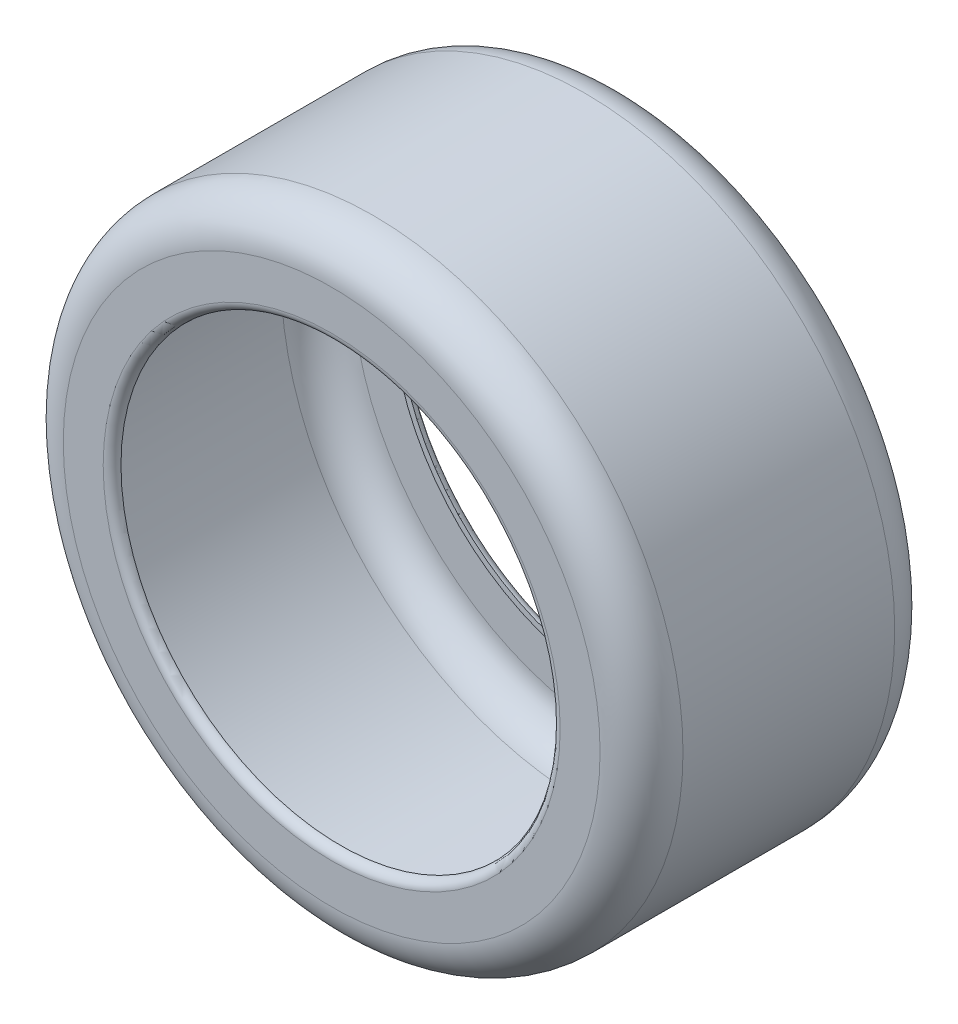
ISO-10303-21;
HEADER;
FILE_DESCRIPTION(('STEP AP214'),'2;1');
FILE_NAME('part.step','',(''),(''),'','','');
FILE_SCHEMA(('AUTOMOTIVE_DESIGN { 1 0 10303 214 1 1 1 1 }'));
ENDSEC;
DATA;
#1=APPLICATION_CONTEXT('core data for automotive mechanical design processes');
#2=APPLICATION_PROTOCOL_DEFINITION('international standard','automotive_design',2000,#1);
#3=PRODUCT_CONTEXT('',#1,'mechanical');
#4=PRODUCT('Part','Part','',(#3));
#5=PRODUCT_RELATED_PRODUCT_CATEGORY('part','',(#4));
#6=PRODUCT_DEFINITION_FORMATION('','',#4);
#7=PRODUCT_DEFINITION_CONTEXT('part definition',#1,'design');
#8=PRODUCT_DEFINITION('design','',#6,#7);
#9=PRODUCT_DEFINITION_SHAPE('','',#8);
#10=(LENGTH_UNIT() NAMED_UNIT(*) SI_UNIT(.MILLI.,.METRE.));
#11=(NAMED_UNIT(*) PLANE_ANGLE_UNIT() SI_UNIT($,.RADIAN.));
#12=(NAMED_UNIT(*) SI_UNIT($,.STERADIAN.) SOLID_ANGLE_UNIT());
#13=UNCERTAINTY_MEASURE_WITH_UNIT(LENGTH_MEASURE(1.E-05),#10,'distance_accuracy_value','');
#14=(GEOMETRIC_REPRESENTATION_CONTEXT(3) GLOBAL_UNCERTAINTY_ASSIGNED_CONTEXT((#13)) GLOBAL_UNIT_ASSIGNED_CONTEXT((#10,
#11,#12)) REPRESENTATION_CONTEXT('',''));
#15=CARTESIAN_POINT('',(0.,0.,0.));
#16=DIRECTION('',(0.,0.,1.));
#17=DIRECTION('',(1.,0.,0.));
#18=AXIS2_PLACEMENT_3D('',#15,#16,#17);
#19=CARTESIAN_POINT('',(0.,0.,124.38));
#20=DIRECTION('',(0.,0.,1.));
#21=DIRECTION('',(1.,0.,0.));
#22=AXIS2_PLACEMENT_3D('',#19,#20,#21);
#23=PLANE('',#22);
#24=CARTESIAN_POINT('',(0.,0.,124.38));
#25=DIRECTION('',(0.,0.,1.));
#26=DIRECTION('',(1.,0.,0.));
#27=AXIS2_PLACEMENT_3D('',#24,#25,#26);
#28=CIRCLE('',#27,192.92);
#29=CARTESIAN_POINT('',(192.92,0.,124.38));
#30=VERTEX_POINT('',#29);
#31=EDGE_CURVE('E11',#30,#30,#28,.F.);
#32=ORIENTED_EDGE('',*,*,#31,.T.);
#33=EDGE_LOOP('',(#32));
#34=FACE_BOUND('',#33,.T.);
#35=CARTESIAN_POINT('',(0.,0.,124.38));
#36=DIRECTION('',(0.,0.,1.));
#37=DIRECTION('',(1.,0.,0.));
#38=AXIS2_PLACEMENT_3D('',#35,#36,#37);
#39=CIRCLE('',#38,226.62);
#40=CARTESIAN_POINT('',(226.62,0.,124.38));
#41=VERTEX_POINT('',#40);
#42=EDGE_CURVE('E51',#41,#41,#39,.T.);
#43=ORIENTED_EDGE('',*,*,#42,.T.);
#44=EDGE_LOOP('',(#43));
#45=FACE_BOUND('',#44,.T.);
#46=ADVANCED_FACE('F40',(#34,#45),#23,.T.);
#47=CARTESIAN_POINT('',(0.,0.,-124.38));
#48=DIRECTION('',(0.,0.,1.));
#49=DIRECTION('',(1.,0.,0.));
#50=AXIS2_PLACEMENT_3D('',#47,#48,#49);
#51=PLANE('',#50);
#52=CARTESIAN_POINT('',(0.,0.,-124.38));
#53=DIRECTION('',(0.,0.,1.));
#54=DIRECTION('',(1.,0.,0.));
#55=AXIS2_PLACEMENT_3D('',#52,#53,#54);
#56=CIRCLE('',#55,192.92);
#57=CARTESIAN_POINT('',(192.92,0.,-124.38));
#58=VERTEX_POINT('',#57);
#59=EDGE_CURVE('E47',#58,#58,#56,.T.);
#60=ORIENTED_EDGE('',*,*,#59,.T.);
#61=EDGE_LOOP('',(#60));
#62=FACE_BOUND('',#61,.T.);
#63=CARTESIAN_POINT('',(0.,0.,-124.38));
#64=DIRECTION('',(0.,0.,1.));
#65=DIRECTION('',(1.,0.,0.));
#66=AXIS2_PLACEMENT_3D('',#63,#64,#65);
#67=CIRCLE('',#66,226.62);
#68=CARTESIAN_POINT('',(226.62,0.,-124.38));
#69=VERTEX_POINT('',#68);
#70=EDGE_CURVE('E55',#69,#69,#67,.F.);
#71=ORIENTED_EDGE('',*,*,#70,.T.);
#72=EDGE_LOOP('',(#71));
#73=FACE_BOUND('',#72,.T.);
#74=ADVANCED_FACE('F112',(#62,#73),#51,.F.);
#75=CARTESIAN_POINT('',(0.,0.,124.38));
#76=DIRECTION('',(0.,0.,-1.));
#77=DIRECTION('',(-1.,0.,0.));
#78=AXIS2_PLACEMENT_3D('',#75,#76,#77);
#79=CYLINDRICAL_SURFACE('',#78,261.62);
#80=CARTESIAN_POINT('',(0.,0.,-89.38));
#81=DIRECTION('',(0.,0.,1.));
#82=DIRECTION('',(1.,0.,0.));
#83=AXIS2_PLACEMENT_3D('',#80,#81,#82);
#84=CIRCLE('',#83,261.62);
#85=CARTESIAN_POINT('',(-261.62,0.,-89.3800000000001));
#86=VERTEX_POINT('',#85);
#87=EDGE_CURVE('E60',#86,#86,#84,.T.);
#88=CARTESIAN_POINT('',(0.,0.,89.38));
#89=DIRECTION('',(0.,0.,1.));
#90=DIRECTION('',(1.,0.,0.));
#91=AXIS2_PLACEMENT_3D('',#88,#89,#90);
#92=CIRCLE('',#91,261.62);
#93=CARTESIAN_POINT('',(-261.62,0.,89.38));
#94=VERTEX_POINT('',#93);
#95=EDGE_CURVE('E63',#94,#94,#92,.F.);
#96=CARTESIAN_POINT('',(-261.62,0.,-89.3800000000001));
#97=CARTESIAN_POINT('',(-261.62,0.,-87.5179166666667));
#98=CARTESIAN_POINT('',(-261.62,0.,-85.6558333333334));
#99=CARTESIAN_POINT('',(-261.62,0.,-81.9316666666667));
#100=CARTESIAN_POINT('',(-261.62,0.,-80.0695833333334));
#101=CARTESIAN_POINT('',(-261.62,0.,-76.3454166666667));
#102=CARTESIAN_POINT('',(-261.62,0.,-74.4833333333334));
#103=CARTESIAN_POINT('',(-261.62,0.,-70.7591666666667));
#104=CARTESIAN_POINT('',(-261.62,0.,-68.8970833333334));
#105=CARTESIAN_POINT('',(-261.62,0.,-65.1729166666667));
#106=CARTESIAN_POINT('',(-261.62,0.,-63.3108333333334));
#107=CARTESIAN_POINT('',(-261.62,0.,-59.5866666666667));
#108=CARTESIAN_POINT('',(-261.62,0.,-57.7245833333334));
#109=CARTESIAN_POINT('',(-261.62,0.,-54.0004166666667));
#110=CARTESIAN_POINT('',(-261.62,0.,-52.1383333333334));
#111=CARTESIAN_POINT('',(-261.62,0.,-48.4141666666667));
#112=CARTESIAN_POINT('',(-261.62,0.,-46.5520833333334));
#113=CARTESIAN_POINT('',(-261.62,0.,-42.8279166666667));
#114=CARTESIAN_POINT('',(-261.62,0.,-40.9658333333334));
#115=CARTESIAN_POINT('',(-261.62,0.,-37.2416666666667));
#116=CARTESIAN_POINT('',(-261.62,0.,-35.3795833333334));
#117=CARTESIAN_POINT('',(-261.62,0.,-31.6554166666667));
#118=CARTESIAN_POINT('',(-261.62,0.,-29.7933333333334));
#119=CARTESIAN_POINT('',(-261.62,0.,-26.0691666666667));
#120=CARTESIAN_POINT('',(-261.62,0.,-24.2070833333334));
#121=CARTESIAN_POINT('',(-261.62,0.,-20.4829166666667));
#122=CARTESIAN_POINT('',(-261.62,0.,-18.6208333333334));
#123=CARTESIAN_POINT('',(-261.62,0.,-14.8966666666667));
#124=CARTESIAN_POINT('',(-261.62,0.,-13.0345833333334));
#125=CARTESIAN_POINT('',(-261.62,0.,-9.31041666666669));
#126=CARTESIAN_POINT('',(-261.62,0.,-7.44833333333335));
#127=CARTESIAN_POINT('',(-261.62,0.,-3.72416666666669));
#128=CARTESIAN_POINT('',(-261.62,0.,-1.86208333333337));
#129=CARTESIAN_POINT('',(-261.62,0.,1.86208333333329));
#130=CARTESIAN_POINT('',(-261.62,0.,3.72416666666663));
#131=CARTESIAN_POINT('',(-261.62,0.,7.44833333333329));
#132=CARTESIAN_POINT('',(-261.62,0.,9.31041666666663));
#133=CARTESIAN_POINT('',(-261.62,0.,13.0345833333333));
#134=CARTESIAN_POINT('',(-261.62,0.,14.8966666666666));
#135=CARTESIAN_POINT('',(-261.62,0.,18.6208333333333));
#136=CARTESIAN_POINT('',(-261.62,0.,20.4829166666666));
#137=CARTESIAN_POINT('',(-261.62,0.,24.2070833333333));
#138=CARTESIAN_POINT('',(-261.62,0.,26.0691666666666));
#139=CARTESIAN_POINT('',(-261.62,0.,29.7933333333333));
#140=CARTESIAN_POINT('',(-261.62,0.,31.6554166666666));
#141=CARTESIAN_POINT('',(-261.62,0.,35.3795833333333));
#142=CARTESIAN_POINT('',(-261.62,0.,37.2416666666666));
#143=CARTESIAN_POINT('',(-261.62,0.,40.9658333333333));
#144=CARTESIAN_POINT('',(-261.62,0.,42.8279166666667));
#145=CARTESIAN_POINT('',(-261.62,0.,46.5520833333333));
#146=CARTESIAN_POINT('',(-261.62,0.,48.4141666666667));
#147=CARTESIAN_POINT('',(-261.62,0.,52.1383333333333));
#148=CARTESIAN_POINT('',(-261.62,0.,54.0004166666667));
#149=CARTESIAN_POINT('',(-261.62,0.,57.7245833333333));
#150=CARTESIAN_POINT('',(-261.62,0.,59.5866666666667));
#151=CARTESIAN_POINT('',(-261.62,0.,63.3108333333333));
#152=CARTESIAN_POINT('',(-261.62,0.,65.1729166666667));
#153=CARTESIAN_POINT('',(-261.62,0.,68.8970833333333));
#154=CARTESIAN_POINT('',(-261.62,0.,70.7591666666666));
#155=CARTESIAN_POINT('',(-261.62,0.,74.4833333333333));
#156=CARTESIAN_POINT('',(-261.62,0.,76.3454166666667));
#157=CARTESIAN_POINT('',(-261.62,0.,80.0695833333333));
#158=CARTESIAN_POINT('',(-261.62,0.,81.9316666666666));
#159=CARTESIAN_POINT('',(-261.62,0.,85.6558333333333));
#160=CARTESIAN_POINT('',(-261.62,0.,87.5179166666667));
#161=CARTESIAN_POINT('',(-261.62,0.,89.38));
#162=B_SPLINE_CURVE_WITH_KNOTS('',3,(#96,#97,#98,#99,#100,#101,#102,#103,#104,#105,#106,#107,
#108,#109,#110,#111,#112,#113,#114,#115,#116,#117,#118,#119,#120,#121,#122,#123,#124,#125,#126,
#127,#128,#129,#130,#131,#132,#133,#134,#135,#136,#137,#138,#139,#140,#141,#142,#143,#144,#145,
#146,#147,#148,#149,#150,#151,#152,#153,#154,#155,#156,#157,#158,#159,#160,#161),.UNSPECIFIED.,
.F.,.F.,(4,2,2,2,2,2,2,2,2,2,2,2,2,2,2,2,2,2,2,2,2,2,2,2,2,2,2,2,2,2,2,2,4),(0.,
5.58625000000001,11.1725,16.75875,22.345,27.93125,33.5175,39.10375,44.69,50.27625,55.8625,
61.44875,67.035,72.62125,78.2075,83.7937500000001,89.38,94.96625,100.5525,106.13875,111.725,
117.31125,122.8975,128.48375,134.07,139.65625,145.2425,150.82875,156.415,162.00125,167.5875,
173.17375,178.76),.UNSPECIFIED.);
#163=EDGE_CURVE('BSEAM117',#86,#94,#162,.T.);
#164=ORIENTED_EDGE('',*,*,#87,.T.);
#165=ORIENTED_EDGE('',*,*,#95,.T.);
#166=ORIENTED_EDGE('',*,*,#163,.T.);
#167=ORIENTED_EDGE('',*,*,#163,.F.);
#168=EDGE_LOOP('',(#164,#166,#165,#167));
#169=FACE_BOUND('',#168,.T.);
#170=ADVANCED_FACE('F117',(#169),#79,.T.);
#171=CARTESIAN_POINT('',(0.,0.,-89.38));
#172=DIRECTION('',(0.,0.,1.));
#173=DIRECTION('',(1.,0.,0.));
#174=AXIS2_PLACEMENT_3D('',#171,#172,#173);
#175=TOROIDAL_SURFACE('',#174,226.62,35.);
#176=ORIENTED_EDGE('',*,*,#70,.F.);
#177=EDGE_LOOP('',(#176));
#178=FACE_BOUND('',#177,.T.);
#179=ORIENTED_EDGE('',*,*,#87,.F.);
#180=EDGE_LOOP('',(#179));
#181=FACE_BOUND('',#180,.T.);
#182=ADVANCED_FACE('F126',(#178,#181),#175,.T.);
#183=CARTESIAN_POINT('',(0.,0.,89.38));
#184=DIRECTION('',(0.,0.,1.));
#185=DIRECTION('',(1.,0.,0.));
#186=AXIS2_PLACEMENT_3D('',#183,#184,#185);
#187=TOROIDAL_SURFACE('',#186,226.62,35.);
#188=ORIENTED_EDGE('',*,*,#95,.F.);
#189=EDGE_LOOP('',(#188));
#190=FACE_BOUND('',#189,.T.);
#191=ORIENTED_EDGE('',*,*,#42,.F.);
#192=EDGE_LOOP('',(#191));
#193=FACE_BOUND('',#192,.T.);
#194=ADVANCED_FACE('F109',(#190,#193),#187,.T.);
#195=CARTESIAN_POINT('',(0.,0.,-116.88));
#196=DIRECTION('',(0.,0.,1.));
#197=DIRECTION('',(1.,0.,0.));
#198=AXIS2_PLACEMENT_3D('',#195,#196,#197);
#199=TOROIDAL_SURFACE('',#198,192.92,7.5);
#200=CARTESIAN_POINT('',(0.,0.,-116.88));
#201=DIRECTION('',(0.,0.,1.));
#202=DIRECTION('',(1.,0.,0.));
#203=AXIS2_PLACEMENT_3D('',#200,#201,#202);
#204=CIRCLE('',#203,185.42);
#205=CARTESIAN_POINT('',(185.42,0.,-116.88));
#206=VERTEX_POINT('',#205);
#207=EDGE_CURVE('E91',#206,#206,#204,.F.);
#208=ORIENTED_EDGE('',*,*,#207,.F.);
#209=EDGE_LOOP('',(#208));
#210=FACE_BOUND('',#209,.T.);
#211=ORIENTED_EDGE('',*,*,#59,.F.);
#212=EDGE_LOOP('',(#211));
#213=FACE_BOUND('',#212,.T.);
#214=ADVANCED_FACE('F101',(#210,#213),#199,.T.);
#215=CARTESIAN_POINT('',(0.,0.,116.88));
#216=DIRECTION('',(0.,0.,1.));
#217=DIRECTION('',(1.,0.,0.));
#218=AXIS2_PLACEMENT_3D('',#215,#216,#217);
#219=TOROIDAL_SURFACE('',#218,192.92,7.5);
#220=ORIENTED_EDGE('',*,*,#31,.F.);
#221=EDGE_LOOP('',(#220));
#222=FACE_BOUND('',#221,.T.);
#223=CARTESIAN_POINT('',(0.,0.,116.88));
#224=DIRECTION('',(0.,0.,1.));
#225=DIRECTION('',(1.,0.,0.));
#226=AXIS2_PLACEMENT_3D('',#223,#224,#225);
#227=CIRCLE('',#226,185.42);
#228=CARTESIAN_POINT('',(185.42,0.,116.88));
#229=VERTEX_POINT('',#228);
#230=EDGE_CURVE('E76',#229,#229,#227,.T.);
#231=ORIENTED_EDGE('',*,*,#230,.F.);
#232=EDGE_LOOP('',(#231));
#233=FACE_BOUND('',#232,.T.);
#234=ADVANCED_FACE('F42',(#222,#233),#219,.T.);
#235=CARTESIAN_POINT('',(0.,0.,116.88));
#236=DIRECTION('',(0.,0.,-1.));
#237=DIRECTION('',(-1.,0.,0.));
#238=AXIS2_PLACEMENT_3D('',#235,#236,#237);
#239=PLANE('',#238);
#240=ORIENTED_EDGE('',*,*,#230,.T.);
#241=EDGE_LOOP('',(#240));
#242=FACE_BOUND('',#241,.T.);
#243=CARTESIAN_POINT('',(0.,0.,116.88));
#244=DIRECTION('',(0.,0.,1.));
#245=DIRECTION('',(1.,0.,0.));
#246=AXIS2_PLACEMENT_3D('',#243,#244,#245);
#247=CIRCLE('',#246,190.42);
#248=CARTESIAN_POINT('',(190.42,0.,116.88));
#249=VERTEX_POINT('',#248);
#250=EDGE_CURVE('E66',#249,#249,#247,.T.);
#251=ORIENTED_EDGE('',*,*,#250,.F.);
#252=EDGE_LOOP('',(#251));
#253=FACE_BOUND('',#252,.T.);
#254=ADVANCED_FACE('F97',(#242,#253),#239,.T.);
#255=CARTESIAN_POINT('',(0.,0.,-116.88));
#256=DIRECTION('',(0.,0.,-1.));
#257=DIRECTION('',(-1.,0.,0.));
#258=AXIS2_PLACEMENT_3D('',#255,#256,#257);
#259=PLANE('',#258);
#260=ORIENTED_EDGE('',*,*,#207,.T.);
#261=EDGE_LOOP('',(#260));
#262=FACE_BOUND('',#261,.T.);
#263=CARTESIAN_POINT('',(0.,0.,-116.88));
#264=DIRECTION('',(0.,0.,1.));
#265=DIRECTION('',(1.,0.,0.));
#266=AXIS2_PLACEMENT_3D('',#263,#264,#265);
#267=CIRCLE('',#266,190.42);
#268=CARTESIAN_POINT('',(190.42,0.,-116.88));
#269=VERTEX_POINT('',#268);
#270=EDGE_CURVE('E69',#269,#269,#267,.F.);
#271=ORIENTED_EDGE('',*,*,#270,.F.);
#272=EDGE_LOOP('',(#271));
#273=FACE_BOUND('',#272,.T.);
#274=ADVANCED_FACE('F107',(#262,#273),#259,.F.);
#275=CARTESIAN_POINT('',(0.,0.,119.38));
#276=DIRECTION('',(0.,0.,1.));
#277=DIRECTION('',(1.,0.,0.));
#278=AXIS2_PLACEMENT_3D('',#275,#276,#277);
#279=PLANE('',#278);
#280=CARTESIAN_POINT('',(0.,0.,119.38));
#281=DIRECTION('',(0.,0.,1.));
#282=DIRECTION('',(1.,0.,0.));
#283=AXIS2_PLACEMENT_3D('',#280,#281,#282);
#284=CIRCLE('',#283,192.92);
#285=CARTESIAN_POINT('',(192.92,0.,119.38));
#286=VERTEX_POINT('',#285);
#287=EDGE_CURVE('E72',#286,#286,#284,.F.);
#288=ORIENTED_EDGE('',*,*,#287,.F.);
#289=EDGE_LOOP('',(#288));
#290=FACE_BOUND('',#289,.T.);
#291=CARTESIAN_POINT('',(0.,0.,119.38));
#292=DIRECTION('',(0.,0.,1.));
#293=DIRECTION('',(1.,0.,0.));
#294=AXIS2_PLACEMENT_3D('',#291,#292,#293);
#295=CIRCLE('',#294,226.62);
#296=CARTESIAN_POINT('',(226.62,0.,119.38));
#297=VERTEX_POINT('',#296);
#298=EDGE_CURVE('E77',#297,#297,#295,.T.);
#299=ORIENTED_EDGE('',*,*,#298,.F.);
#300=EDGE_LOOP('',(#299));
#301=FACE_BOUND('',#300,.T.);
#302=ADVANCED_FACE('F172',(#290,#301),#279,.F.);
#303=CARTESIAN_POINT('',(0.,0.,-119.38));
#304=DIRECTION('',(0.,0.,1.));
#305=DIRECTION('',(1.,0.,0.));
#306=AXIS2_PLACEMENT_3D('',#303,#304,#305);
#307=PLANE('',#306);
#308=CARTESIAN_POINT('',(0.,0.,-119.38));
#309=DIRECTION('',(0.,0.,1.));
#310=DIRECTION('',(1.,0.,0.));
#311=AXIS2_PLACEMENT_3D('',#308,#309,#310);
#312=CIRCLE('',#311,192.92);
#313=CARTESIAN_POINT('',(192.92,0.,-119.38));
#314=VERTEX_POINT('',#313);
#315=EDGE_CURVE('E73',#314,#314,#312,.T.);
#316=ORIENTED_EDGE('',*,*,#315,.F.);
#317=EDGE_LOOP('',(#316));
#318=FACE_BOUND('',#317,.T.);
#319=CARTESIAN_POINT('',(0.,0.,-119.38));
#320=DIRECTION('',(0.,0.,1.));
#321=DIRECTION('',(1.,0.,0.));
#322=AXIS2_PLACEMENT_3D('',#319,#320,#321);
#323=CIRCLE('',#322,226.62);
#324=CARTESIAN_POINT('',(226.62,0.,-119.38));
#325=VERTEX_POINT('',#324);
#326=EDGE_CURVE('E78',#325,#325,#323,.F.);
#327=ORIENTED_EDGE('',*,*,#326,.F.);
#328=EDGE_LOOP('',(#327));
#329=FACE_BOUND('',#328,.T.);
#330=ADVANCED_FACE('F182',(#318,#329),#307,.T.);
#331=CARTESIAN_POINT('',(0.,0.,124.38));
#332=DIRECTION('',(0.,0.,-1.));
#333=DIRECTION('',(-1.,0.,0.));
#334=AXIS2_PLACEMENT_3D('',#331,#332,#333);
#335=CYLINDRICAL_SURFACE('',#334,256.62);
#336=CARTESIAN_POINT('',(0.,0.,-89.38));
#337=DIRECTION('',(0.,0.,-1.));
#338=DIRECTION('',(-1.,0.,0.));
#339=AXIS2_PLACEMENT_3D('',#336,#337,#338);
#340=CIRCLE('',#339,256.62);
#341=CARTESIAN_POINT('',(-256.62,0.,-89.38));
#342=VERTEX_POINT('',#341);
#343=EDGE_CURVE('E81',#342,#342,#340,.F.);
#344=CARTESIAN_POINT('',(0.,0.,89.38));
#345=DIRECTION('',(0.,0.,-1.));
#346=DIRECTION('',(-1.,0.,0.));
#347=AXIS2_PLACEMENT_3D('',#344,#345,#346);
#348=CIRCLE('',#347,256.62);
#349=CARTESIAN_POINT('',(-256.62,0.,89.38));
#350=VERTEX_POINT('',#349);
#351=EDGE_CURVE('E84',#350,#350,#348,.T.);
#352=CARTESIAN_POINT('',(-256.62,0.,-89.38));
#353=CARTESIAN_POINT('',(-256.62,0.,-87.5179166666666));
#354=CARTESIAN_POINT('',(-256.62,0.,-85.6558333333333));
#355=CARTESIAN_POINT('',(-256.62,0.,-81.9316666666666));
#356=CARTESIAN_POINT('',(-256.62,0.,-80.0695833333333));
#357=CARTESIAN_POINT('',(-256.62,0.,-76.3454166666666));
#358=CARTESIAN_POINT('',(-256.62,0.,-74.4833333333333));
#359=CARTESIAN_POINT('',(-256.62,0.,-70.7591666666666));
#360=CARTESIAN_POINT('',(-256.62,0.,-68.8970833333333));
#361=CARTESIAN_POINT('',(-256.62,0.,-65.1729166666666));
#362=CARTESIAN_POINT('',(-256.62,0.,-63.3108333333333));
#363=CARTESIAN_POINT('',(-256.62,0.,-59.5866666666666));
#364=CARTESIAN_POINT('',(-256.62,0.,-57.7245833333333));
#365=CARTESIAN_POINT('',(-256.62,0.,-54.0004166666666));
#366=CARTESIAN_POINT('',(-256.62,0.,-52.1383333333333));
#367=CARTESIAN_POINT('',(-256.62,0.,-48.4141666666666));
#368=CARTESIAN_POINT('',(-256.62,0.,-46.5520833333333));
#369=CARTESIAN_POINT('',(-256.62,0.,-42.8279166666666));
#370=CARTESIAN_POINT('',(-256.62,0.,-40.9658333333333));
#371=CARTESIAN_POINT('',(-256.62,0.,-37.2416666666666));
#372=CARTESIAN_POINT('',(-256.62,0.,-35.3795833333333));
#373=CARTESIAN_POINT('',(-256.62,0.,-31.6554166666666));
#374=CARTESIAN_POINT('',(-256.62,0.,-29.7933333333333));
#375=CARTESIAN_POINT('',(-256.62,0.,-26.0691666666666));
#376=CARTESIAN_POINT('',(-256.62,0.,-24.2070833333333));
#377=CARTESIAN_POINT('',(-256.62,0.,-20.4829166666666));
#378=CARTESIAN_POINT('',(-256.62,0.,-18.6208333333333));
#379=CARTESIAN_POINT('',(-256.62,0.,-14.8966666666666));
#380=CARTESIAN_POINT('',(-256.62,0.,-13.0345833333333));
#381=CARTESIAN_POINT('',(-256.62,0.,-9.31041666666662));
#382=CARTESIAN_POINT('',(-256.62,0.,-7.44833333333329));
#383=CARTESIAN_POINT('',(-256.62,0.,-3.72416666666663));
#384=CARTESIAN_POINT('',(-256.62,0.,-1.86208333333329));
#385=CARTESIAN_POINT('',(-256.62,0.,1.86208333333337));
#386=CARTESIAN_POINT('',(-256.62,0.,3.72416666666671));
#387=CARTESIAN_POINT('',(-256.62,0.,7.44833333333338));
#388=CARTESIAN_POINT('',(-256.62,0.,9.31041666666671));
#389=CARTESIAN_POINT('',(-256.62,0.,13.0345833333334));
#390=CARTESIAN_POINT('',(-256.62,0.,14.8966666666667));
#391=CARTESIAN_POINT('',(-256.62,0.,18.6208333333334));
#392=CARTESIAN_POINT('',(-256.62,0.,20.4829166666667));
#393=CARTESIAN_POINT('',(-256.62,0.,24.2070833333334));
#394=CARTESIAN_POINT('',(-256.62,0.,26.0691666666667));
#395=CARTESIAN_POINT('',(-256.62,0.,29.7933333333334));
#396=CARTESIAN_POINT('',(-256.62,0.,31.6554166666667));
#397=CARTESIAN_POINT('',(-256.62,0.,35.3795833333334));
#398=CARTESIAN_POINT('',(-256.62,0.,37.2416666666667));
#399=CARTESIAN_POINT('',(-256.62,0.,40.9658333333334));
#400=CARTESIAN_POINT('',(-256.62,0.,42.8279166666667));
#401=CARTESIAN_POINT('',(-256.62,0.,46.5520833333334));
#402=CARTESIAN_POINT('',(-256.62,0.,48.4141666666667));
#403=CARTESIAN_POINT('',(-256.62,0.,52.1383333333334));
#404=CARTESIAN_POINT('',(-256.62,0.,54.0004166666667));
#405=CARTESIAN_POINT('',(-256.62,0.,57.7245833333334));
#406=CARTESIAN_POINT('',(-256.62,0.,59.5866666666667));
#407=CARTESIAN_POINT('',(-256.62,0.,63.3108333333334));
#408=CARTESIAN_POINT('',(-256.62,0.,65.1729166666667));
#409=CARTESIAN_POINT('',(-256.62,0.,68.8970833333334));
#410=CARTESIAN_POINT('',(-256.62,0.,70.7591666666667));
#411=CARTESIAN_POINT('',(-256.62,0.,74.4833333333334));
#412=CARTESIAN_POINT('',(-256.62,0.,76.3454166666667));
#413=CARTESIAN_POINT('',(-256.62,0.,80.0695833333334));
#414=CARTESIAN_POINT('',(-256.62,0.,81.9316666666667));
#415=CARTESIAN_POINT('',(-256.62,0.,85.6558333333334));
#416=CARTESIAN_POINT('',(-256.62,0.,87.5179166666667));
#417=CARTESIAN_POINT('',(-256.62,0.,89.38));
#418=B_SPLINE_CURVE_WITH_KNOTS('',3,(#352,#353,#354,#355,#356,#357,#358,#359,#360,#361,#362,
#363,#364,#365,#366,#367,#368,#369,#370,#371,#372,#373,#374,#375,#376,#377,#378,#379,#380,#381,
#382,#383,#384,#385,#386,#387,#388,#389,#390,#391,#392,#393,#394,#395,#396,#397,#398,#399,#400,
#401,#402,#403,#404,#405,#406,#407,#408,#409,#410,#411,#412,#413,#414,#415,#416,#417),
.UNSPECIFIED.,.F.,.F.,(4,2,2,2,2,2,2,2,2,2,2,2,2,2,2,2,2,2,2,2,2,2,2,2,2,2,2,2,2,2,2,2,4),(0.,
5.58625000000001,11.1725,16.75875,22.345,27.93125,33.5175,39.10375,44.69,50.27625,55.8625,
61.44875,67.035,72.62125,78.2075,83.79375,89.38,94.96625,100.5525,106.13875,111.725,117.31125,
122.8975,128.48375,134.07,139.65625,145.2425,150.82875,156.415,162.00125,167.5875,173.17375,
178.76),.UNSPECIFIED.);
#419=EDGE_CURVE('BSEAM193',#342,#350,#418,.T.);
#420=ORIENTED_EDGE('',*,*,#343,.F.);
#421=ORIENTED_EDGE('',*,*,#351,.F.);
#422=ORIENTED_EDGE('',*,*,#419,.T.);
#423=ORIENTED_EDGE('',*,*,#419,.F.);
#424=EDGE_LOOP('',(#420,#422,#421,#423));
#425=FACE_BOUND('',#424,.T.);
#426=ADVANCED_FACE('F193',(#425),#335,.F.);
#427=CARTESIAN_POINT('',(0.,0.,-89.38));
#428=DIRECTION('',(0.,0.,1.));
#429=DIRECTION('',(1.,0.,0.));
#430=AXIS2_PLACEMENT_3D('',#427,#428,#429);
#431=TOROIDAL_SURFACE('',#430,226.62,30.);
#432=ORIENTED_EDGE('',*,*,#326,.T.);
#433=EDGE_LOOP('',(#432));
#434=FACE_BOUND('',#433,.T.);
#435=ORIENTED_EDGE('',*,*,#343,.T.);
#436=EDGE_LOOP('',(#435));
#437=FACE_BOUND('',#436,.T.);
#438=ADVANCED_FACE('F204',(#434,#437),#431,.F.);
#439=CARTESIAN_POINT('',(0.,0.,89.38));
#440=DIRECTION('',(0.,0.,1.));
#441=DIRECTION('',(1.,0.,0.));
#442=AXIS2_PLACEMENT_3D('',#439,#440,#441);
#443=TOROIDAL_SURFACE('',#442,226.62,30.);
#444=ORIENTED_EDGE('',*,*,#351,.T.);
#445=EDGE_LOOP('',(#444));
#446=FACE_BOUND('',#445,.T.);
#447=ORIENTED_EDGE('',*,*,#298,.T.);
#448=EDGE_LOOP('',(#447));
#449=FACE_BOUND('',#448,.T.);
#450=ADVANCED_FACE('F214',(#446,#449),#443,.F.);
#451=CARTESIAN_POINT('',(0.,0.,-116.88));
#452=DIRECTION('',(0.,0.,1.));
#453=DIRECTION('',(1.,0.,0.));
#454=AXIS2_PLACEMENT_3D('',#451,#452,#453);
#455=TOROIDAL_SURFACE('',#454,192.92,2.5);
#456=ORIENTED_EDGE('',*,*,#270,.T.);
#457=EDGE_LOOP('',(#456));
#458=FACE_BOUND('',#457,.T.);
#459=ORIENTED_EDGE('',*,*,#315,.T.);
#460=EDGE_LOOP('',(#459));
#461=FACE_BOUND('',#460,.T.);
#462=ADVANCED_FACE('F224',(#458,#461),#455,.F.);
#463=CARTESIAN_POINT('',(0.,0.,116.88));
#464=DIRECTION('',(0.,0.,1.));
#465=DIRECTION('',(1.,0.,0.));
#466=AXIS2_PLACEMENT_3D('',#463,#464,#465);
#467=TOROIDAL_SURFACE('',#466,192.92,2.5);
#468=ORIENTED_EDGE('',*,*,#287,.T.);
#469=EDGE_LOOP('',(#468));
#470=FACE_BOUND('',#469,.T.);
#471=ORIENTED_EDGE('',*,*,#250,.T.);
#472=EDGE_LOOP('',(#471));
#473=FACE_BOUND('',#472,.T.);
#474=ADVANCED_FACE('F121',(#470,#473),#467,.F.);
#475=CLOSED_SHELL('',(#46,#74,#170,#182,#194,#214,#234,#254,#274,#302,#330,#426,#438,#450,#462,#474));
#476=MANIFOLD_SOLID_BREP('B2',#475);
#477=ADVANCED_BREP_SHAPE_REPRESENTATION('',(#18,#476),#14);
#478=SHAPE_DEFINITION_REPRESENTATION(#9,#477);
ENDSEC;
END-ISO-10303-21;
